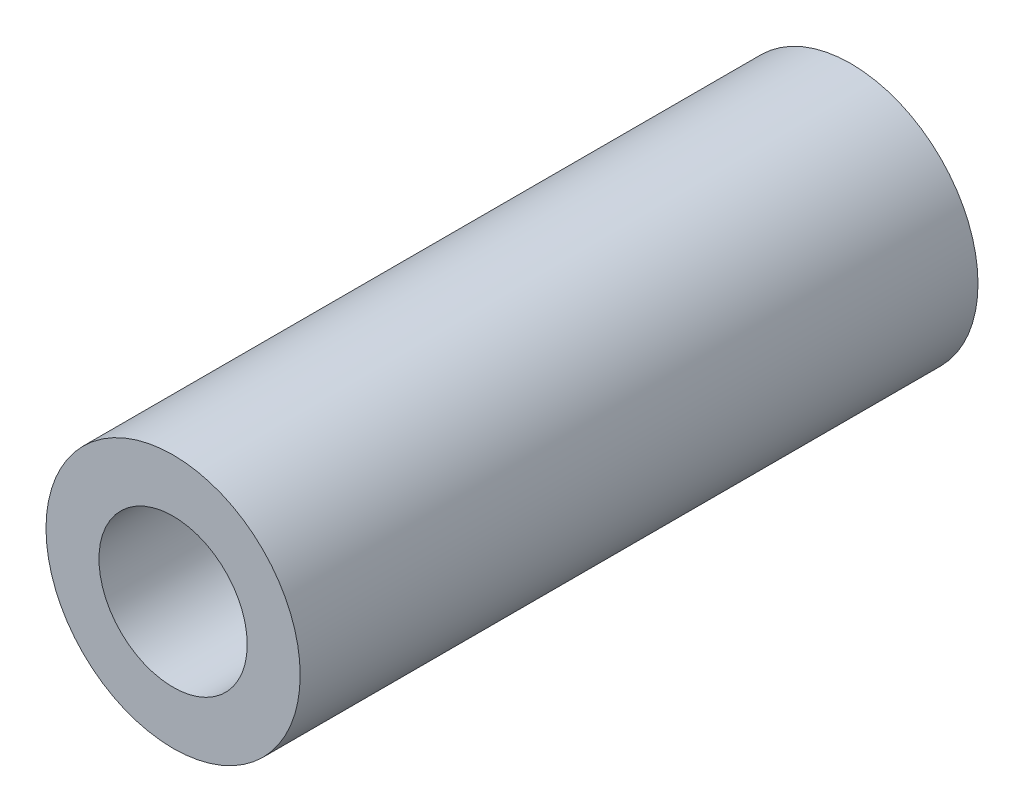
ISO-10303-21;
HEADER;
FILE_DESCRIPTION(('STEP AP214'),'2;1');
FILE_NAME('part.step','',(''),(''),'','','');
FILE_SCHEMA(('AUTOMOTIVE_DESIGN { 1 0 10303 214 1 1 1 1 }'));
ENDSEC;
DATA;
#1=APPLICATION_CONTEXT('core data for automotive mechanical design processes');
#2=APPLICATION_PROTOCOL_DEFINITION('international standard','automotive_design',2000,#1);
#3=PRODUCT_CONTEXT('',#1,'mechanical');
#4=PRODUCT('Part','Part','',(#3));
#5=PRODUCT_RELATED_PRODUCT_CATEGORY('part','',(#4));
#6=PRODUCT_DEFINITION_FORMATION('','',#4);
#7=PRODUCT_DEFINITION_CONTEXT('part definition',#1,'design');
#8=PRODUCT_DEFINITION('design','',#6,#7);
#9=PRODUCT_DEFINITION_SHAPE('','',#8);
#10=(LENGTH_UNIT() NAMED_UNIT(*) SI_UNIT(.MILLI.,.METRE.));
#11=(NAMED_UNIT(*) PLANE_ANGLE_UNIT() SI_UNIT($,.RADIAN.));
#12=(NAMED_UNIT(*) SI_UNIT($,.STERADIAN.) SOLID_ANGLE_UNIT());
#13=UNCERTAINTY_MEASURE_WITH_UNIT(LENGTH_MEASURE(1.E-05),#10,'distance_accuracy_value','');
#14=(GEOMETRIC_REPRESENTATION_CONTEXT(3) GLOBAL_UNCERTAINTY_ASSIGNED_CONTEXT((#13)) GLOBAL_UNIT_ASSIGNED_CONTEXT((#10,
#11,#12)) REPRESENTATION_CONTEXT('',''));
#15=CARTESIAN_POINT('',(0.,0.,0.));
#16=DIRECTION('',(0.,0.,1.));
#17=DIRECTION('',(1.,0.,0.));
#18=AXIS2_PLACEMENT_3D('',#15,#16,#17);
#19=CARTESIAN_POINT('',(0.,0.,16.));
#20=DIRECTION('',(0.,0.,-1.));
#21=DIRECTION('',(-1.,0.,0.));
#22=AXIS2_PLACEMENT_3D('',#19,#20,#21);
#23=CYLINDRICAL_SURFACE('',#22,3.);
#24=CARTESIAN_POINT('',(0.,0.,16.));
#25=DIRECTION('',(0.,0.,1.));
#26=DIRECTION('',(1.,0.,0.));
#27=AXIS2_PLACEMENT_3D('',#24,#25,#26);
#28=CIRCLE('',#27,3.);
#29=CARTESIAN_POINT('',(3.,0.,16.));
#30=VERTEX_POINT('',#29);
#31=EDGE_CURVE('E10',#30,#30,#28,.T.);
#32=ORIENTED_EDGE('',*,*,#31,.F.);
#33=EDGE_LOOP('',(#32));
#34=FACE_BOUND('',#33,.T.);
#35=CARTESIAN_POINT('',(0.,0.,0.));
#36=DIRECTION('',(0.,0.,1.));
#37=DIRECTION('',(1.,0.,0.));
#38=AXIS2_PLACEMENT_3D('',#35,#36,#37);
#39=CIRCLE('',#38,3.);
#40=CARTESIAN_POINT('',(3.,0.,0.));
#41=VERTEX_POINT('',#40);
#42=EDGE_CURVE('E40',#41,#41,#39,.T.);
#43=ORIENTED_EDGE('',*,*,#42,.T.);
#44=EDGE_LOOP('',(#43));
#45=FACE_BOUND('',#44,.T.);
#46=ADVANCED_FACE('F37',(#34,#45),#23,.T.);
#47=CARTESIAN_POINT('',(0.,0.,16.));
#48=DIRECTION('',(0.,0.,1.));
#49=DIRECTION('',(1.,0.,0.));
#50=AXIS2_PLACEMENT_3D('',#47,#48,#49);
#51=PLANE('',#50);
#52=CARTESIAN_POINT('',(0.,0.,16.));
#53=DIRECTION('',(0.,0.,1.));
#54=DIRECTION('',(1.,0.,0.));
#55=AXIS2_PLACEMENT_3D('',#52,#53,#54);
#56=CIRCLE('',#55,1.75);
#57=CARTESIAN_POINT('',(1.75,0.,16.));
#58=VERTEX_POINT('',#57);
#59=EDGE_CURVE('E49',#58,#58,#56,.T.);
#60=ORIENTED_EDGE('',*,*,#59,.F.);
#61=EDGE_LOOP('',(#60));
#62=FACE_BOUND('',#61,.T.);
#63=ORIENTED_EDGE('',*,*,#31,.T.);
#64=EDGE_LOOP('',(#63));
#65=FACE_BOUND('',#64,.T.);
#66=ADVANCED_FACE('F64',(#62,#65),#51,.T.);
#67=CARTESIAN_POINT('',(0.,0.,0.));
#68=DIRECTION('',(0.,0.,1.));
#69=DIRECTION('',(1.,0.,0.));
#70=AXIS2_PLACEMENT_3D('',#67,#68,#69);
#71=PLANE('',#70);
#72=CARTESIAN_POINT('',(0.,0.,0.));
#73=DIRECTION('',(0.,0.,1.));
#74=DIRECTION('',(1.,0.,0.));
#75=AXIS2_PLACEMENT_3D('',#72,#73,#74);
#76=CIRCLE('',#75,1.75);
#77=CARTESIAN_POINT('',(1.75,0.,0.));
#78=VERTEX_POINT('',#77);
#79=EDGE_CURVE('E47',#78,#78,#76,.T.);
#80=ORIENTED_EDGE('',*,*,#79,.T.);
#81=EDGE_LOOP('',(#80));
#82=FACE_BOUND('',#81,.T.);
#83=ORIENTED_EDGE('',*,*,#42,.F.);
#84=EDGE_LOOP('',(#83));
#85=FACE_BOUND('',#84,.T.);
#86=ADVANCED_FACE('F55',(#82,#85),#71,.F.);
#87=CARTESIAN_POINT('',(0.,0.,0.));
#88=DIRECTION('',(0.,0.,1.));
#89=DIRECTION('',(1.,0.,0.));
#90=AXIS2_PLACEMENT_3D('',#87,#88,#89);
#91=CYLINDRICAL_SURFACE('',#90,1.75);
#92=ORIENTED_EDGE('',*,*,#79,.F.);
#93=EDGE_LOOP('',(#92));
#94=FACE_BOUND('',#93,.T.);
#95=ORIENTED_EDGE('',*,*,#59,.T.);
#96=EDGE_LOOP('',(#95));
#97=FACE_BOUND('',#96,.T.);
#98=ADVANCED_FACE('F58',(#94,#97),#91,.F.);
#99=CLOSED_SHELL('',(#46,#66,#86,#98));
#100=MANIFOLD_SOLID_BREP('B2',#99);
#101=ADVANCED_BREP_SHAPE_REPRESENTATION('',(#18,#100),#14);
#102=SHAPE_DEFINITION_REPRESENTATION(#9,#101);
ENDSEC;
END-ISO-10303-21;
